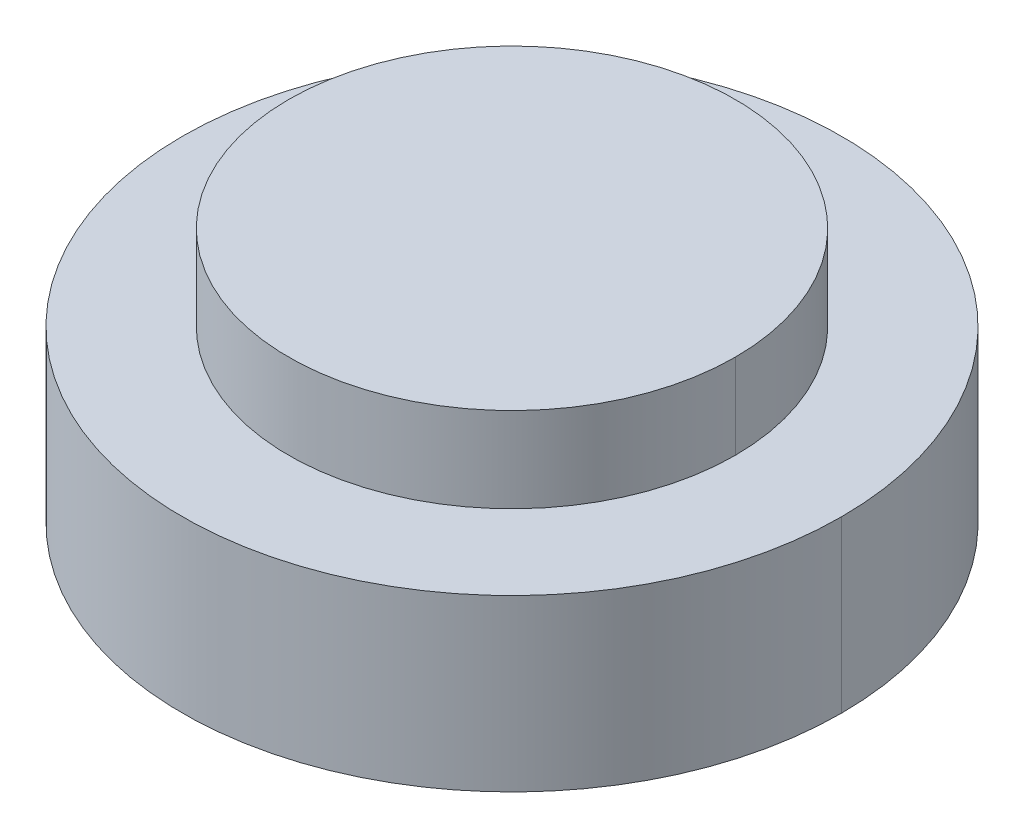
ISO-10303-21;
HEADER;
FILE_DESCRIPTION(('STEP AP214'),'2;1');
FILE_NAME('part.step','',(''),(''),'','','');
FILE_SCHEMA(('AUTOMOTIVE_DESIGN { 1 0 10303 214 1 1 1 1 }'));
ENDSEC;
DATA;
#1=APPLICATION_CONTEXT('core data for automotive mechanical design processes');
#2=APPLICATION_PROTOCOL_DEFINITION('international standard','automotive_design',2000,#1);
#3=PRODUCT_CONTEXT('',#1,'mechanical');
#4=PRODUCT('Part','Part','',(#3));
#5=PRODUCT_RELATED_PRODUCT_CATEGORY('part','',(#4));
#6=PRODUCT_DEFINITION_FORMATION('','',#4);
#7=PRODUCT_DEFINITION_CONTEXT('part definition',#1,'design');
#8=PRODUCT_DEFINITION('design','',#6,#7);
#9=PRODUCT_DEFINITION_SHAPE('','',#8);
#10=(LENGTH_UNIT() NAMED_UNIT(*) SI_UNIT(.MILLI.,.METRE.));
#11=(NAMED_UNIT(*) PLANE_ANGLE_UNIT() SI_UNIT($,.RADIAN.));
#12=(NAMED_UNIT(*) SI_UNIT($,.STERADIAN.) SOLID_ANGLE_UNIT());
#13=UNCERTAINTY_MEASURE_WITH_UNIT(LENGTH_MEASURE(1.E-05),#10,'distance_accuracy_value','');
#14=(GEOMETRIC_REPRESENTATION_CONTEXT(3) GLOBAL_UNCERTAINTY_ASSIGNED_CONTEXT((#13)) GLOBAL_UNIT_ASSIGNED_CONTEXT((#10,
#11,#12)) REPRESENTATION_CONTEXT('',''));
#15=CARTESIAN_POINT('',(0.,0.,0.));
#16=DIRECTION('',(0.,0.,1.));
#17=DIRECTION('',(1.,0.,0.));
#18=AXIS2_PLACEMENT_3D('',#15,#16,#17);
#19=CARTESIAN_POINT('',(0.,150.,0.));
#20=DIRECTION('',(0.,1.,0.));
#21=DIRECTION('',(1.,0.,0.));
#22=AXIS2_PLACEMENT_3D('',#19,#20,#21);
#23=PLANE('',#22);
#24=CARTESIAN_POINT('',(0.,150.,0.));
#25=DIRECTION('',(0.,-1.,0.));
#26=DIRECTION('',(1.,0.,0.));
#27=AXIS2_PLACEMENT_3D('',#24,#25,#26);
#28=CIRCLE('',#27,7.75);
#29=CARTESIAN_POINT('',(-7.75,150.,0.));
#30=VERTEX_POINT('',#29);
#31=CARTESIAN_POINT('',(7.75,150.,0.));
#32=VERTEX_POINT('',#31);
#33=EDGE_CURVE('E106',#30,#32,#28,.T.);
#34=ORIENTED_EDGE('',*,*,#33,.F.);
#35=CARTESIAN_POINT('',(0.,150.,0.));
#36=DIRECTION('',(0.,-1.,0.));
#37=DIRECTION('',(1.,0.,0.));
#38=AXIS2_PLACEMENT_3D('',#35,#36,#37);
#39=CIRCLE('',#38,7.75);
#40=EDGE_CURVE('E136',#32,#30,#39,.T.);
#41=ORIENTED_EDGE('',*,*,#40,.F.);
#42=EDGE_LOOP('',(#34,#41));
#43=FACE_BOUND('',#42,.T.);
#44=CARTESIAN_POINT('',(0.,150.,0.));
#45=DIRECTION('',(0.,1.,0.));
#46=DIRECTION('',(1.,0.,0.));
#47=AXIS2_PLACEMENT_3D('',#44,#45,#46);
#48=CIRCLE('',#47,77.5);
#49=CARTESIAN_POINT('',(-77.5,150.,0.));
#50=VERTEX_POINT('',#49);
#51=CARTESIAN_POINT('',(77.5,150.,0.));
#52=VERTEX_POINT('',#51);
#53=EDGE_CURVE('E10',#50,#52,#48,.T.);
#54=ORIENTED_EDGE('',*,*,#53,.F.);
#55=CARTESIAN_POINT('',(0.,150.,0.));
#56=DIRECTION('',(0.,1.,0.));
#57=DIRECTION('',(1.,0.,0.));
#58=AXIS2_PLACEMENT_3D('',#55,#56,#57);
#59=CIRCLE('',#58,77.5);
#60=EDGE_CURVE('E113',#52,#50,#59,.T.);
#61=ORIENTED_EDGE('',*,*,#60,.F.);
#62=EDGE_LOOP('',(#54,#61));
#63=FACE_BOUND('',#62,.T.);
#64=ADVANCED_FACE('F16',(#43,#63),#23,.F.);
#65=CARTESIAN_POINT('',(0.,170.,0.));
#66=DIRECTION('',(0.,1.,0.));
#67=DIRECTION('',(-1.,0.,0.));
#68=AXIS2_PLACEMENT_3D('',#65,#66,#67);
#69=CYLINDRICAL_SURFACE('',#68,77.5);
#70=DIRECTION('',(0.,1.,0.));
#71=VECTOR('',#70,1.);
#72=CARTESIAN_POINT('',(-77.5,170.,0.));
#73=LINE('',#72,#71);
#74=CARTESIAN_POINT('',(-77.5,190.,0.));
#75=VERTEX_POINT('',#74);
#76=EDGE_CURVE('E26',#50,#75,#73,.T.);
#77=ORIENTED_EDGE('',*,*,#76,.F.);
#78=ORIENTED_EDGE('',*,*,#53,.T.);
#79=DIRECTION('',(0.,1.,0.));
#80=VECTOR('',#79,1.);
#81=CARTESIAN_POINT('',(77.5,170.,0.));
#82=LINE('',#81,#80);
#83=CARTESIAN_POINT('',(77.5,190.,0.));
#84=VERTEX_POINT('',#83);
#85=EDGE_CURVE('E122',#52,#84,#82,.T.);
#86=ORIENTED_EDGE('',*,*,#85,.T.);
#87=CARTESIAN_POINT('',(0.,190.,0.));
#88=DIRECTION('',(0.,1.,0.));
#89=DIRECTION('',(1.,0.,0.));
#90=AXIS2_PLACEMENT_3D('',#87,#88,#89);
#91=CIRCLE('',#90,77.5);
#92=EDGE_CURVE('E117',#75,#84,#91,.T.);
#93=ORIENTED_EDGE('',*,*,#92,.F.);
#94=EDGE_LOOP('',(#77,#78,#86,#93));
#95=FACE_BOUND('',#94,.T.);
#96=ADVANCED_FACE('F152',(#95),#69,.T.);
#97=CARTESIAN_POINT('',(0.,170.,0.));
#98=DIRECTION('',(0.,1.,0.));
#99=DIRECTION('',(-1.,0.,0.));
#100=AXIS2_PLACEMENT_3D('',#97,#98,#99);
#101=CYLINDRICAL_SURFACE('',#100,77.5);
#102=ORIENTED_EDGE('',*,*,#85,.F.);
#103=ORIENTED_EDGE('',*,*,#60,.T.);
#104=ORIENTED_EDGE('',*,*,#76,.T.);
#105=CARTESIAN_POINT('',(0.,190.,0.));
#106=DIRECTION('',(0.,1.,0.));
#107=DIRECTION('',(1.,0.,0.));
#108=AXIS2_PLACEMENT_3D('',#105,#106,#107);
#109=CIRCLE('',#108,77.5);
#110=EDGE_CURVE('E121',#84,#75,#109,.T.);
#111=ORIENTED_EDGE('',*,*,#110,.F.);
#112=EDGE_LOOP('',(#102,#103,#104,#111));
#113=FACE_BOUND('',#112,.T.);
#114=ADVANCED_FACE('F153',(#113),#101,.T.);
#115=CARTESIAN_POINT('',(0.,190.,0.));
#116=DIRECTION('',(0.,1.,0.));
#117=DIRECTION('',(1.,0.,0.));
#118=AXIS2_PLACEMENT_3D('',#115,#116,#117);
#119=PLANE('',#118);
#120=CARTESIAN_POINT('',(0.,190.,0.));
#121=DIRECTION('',(0.,1.,0.));
#122=DIRECTION('',(1.,0.,0.));
#123=AXIS2_PLACEMENT_3D('',#120,#121,#122);
#124=CIRCLE('',#123,52.5);
#125=CARTESIAN_POINT('',(52.5,190.,0.));
#126=VERTEX_POINT('',#125);
#127=CARTESIAN_POINT('',(-52.5,190.,0.));
#128=VERTEX_POINT('',#127);
#129=EDGE_CURVE('E114',#126,#128,#124,.T.);
#130=ORIENTED_EDGE('',*,*,#129,.F.);
#131=CARTESIAN_POINT('',(0.,190.,0.));
#132=DIRECTION('',(0.,1.,0.));
#133=DIRECTION('',(1.,0.,0.));
#134=AXIS2_PLACEMENT_3D('',#131,#132,#133);
#135=CIRCLE('',#134,52.5);
#136=EDGE_CURVE('E87',#128,#126,#135,.T.);
#137=ORIENTED_EDGE('',*,*,#136,.F.);
#138=EDGE_LOOP('',(#130,#137));
#139=FACE_BOUND('',#138,.T.);
#140=ORIENTED_EDGE('',*,*,#92,.T.);
#141=ORIENTED_EDGE('',*,*,#110,.T.);
#142=EDGE_LOOP('',(#140,#141));
#143=FACE_BOUND('',#142,.T.);
#144=ADVANCED_FACE('F148',(#139,#143),#119,.T.);
#145=CARTESIAN_POINT('',(0.,180.,0.));
#146=DIRECTION('',(0.,1.,0.));
#147=DIRECTION('',(-1.,0.,0.));
#148=AXIS2_PLACEMENT_3D('',#145,#146,#147);
#149=CYLINDRICAL_SURFACE('',#148,52.5);
#150=DIRECTION('',(0.,1.,0.));
#151=VECTOR('',#150,1.);
#152=CARTESIAN_POINT('',(-52.5,180.,0.));
#153=LINE('',#152,#151);
#154=CARTESIAN_POINT('',(-52.5,210.,0.));
#155=VERTEX_POINT('',#154);
#156=EDGE_CURVE('E90',#128,#155,#153,.T.);
#157=ORIENTED_EDGE('',*,*,#156,.T.);
#158=CARTESIAN_POINT('',(0.,210.,0.));
#159=DIRECTION('',(0.,1.,0.));
#160=DIRECTION('',(1.,0.,0.));
#161=AXIS2_PLACEMENT_3D('',#158,#159,#160);
#162=CIRCLE('',#161,52.5);
#163=CARTESIAN_POINT('',(52.5,210.,0.));
#164=VERTEX_POINT('',#163);
#165=EDGE_CURVE('E91',#164,#155,#162,.T.);
#166=ORIENTED_EDGE('',*,*,#165,.F.);
#167=DIRECTION('',(0.,1.,0.));
#168=VECTOR('',#167,1.);
#169=CARTESIAN_POINT('',(52.5,180.,0.));
#170=LINE('',#169,#168);
#171=EDGE_CURVE('E80',#126,#164,#170,.T.);
#172=ORIENTED_EDGE('',*,*,#171,.F.);
#173=ORIENTED_EDGE('',*,*,#129,.T.);
#174=EDGE_LOOP('',(#157,#166,#172,#173));
#175=FACE_BOUND('',#174,.T.);
#176=ADVANCED_FACE('F94',(#175),#149,.T.);
#177=CARTESIAN_POINT('',(0.,180.,0.));
#178=DIRECTION('',(0.,1.,0.));
#179=DIRECTION('',(-1.,0.,0.));
#180=AXIS2_PLACEMENT_3D('',#177,#178,#179);
#181=CYLINDRICAL_SURFACE('',#180,52.5);
#182=ORIENTED_EDGE('',*,*,#171,.T.);
#183=CARTESIAN_POINT('',(0.,210.,0.));
#184=DIRECTION('',(0.,1.,0.));
#185=DIRECTION('',(1.,0.,0.));
#186=AXIS2_PLACEMENT_3D('',#183,#184,#185);
#187=CIRCLE('',#186,52.5);
#188=EDGE_CURVE('E85',#155,#164,#187,.T.);
#189=ORIENTED_EDGE('',*,*,#188,.F.);
#190=ORIENTED_EDGE('',*,*,#156,.F.);
#191=ORIENTED_EDGE('',*,*,#136,.T.);
#192=EDGE_LOOP('',(#182,#189,#190,#191));
#193=FACE_BOUND('',#192,.T.);
#194=ADVANCED_FACE('F82',(#193),#181,.T.);
#195=CARTESIAN_POINT('',(0.,210.,0.));
#196=DIRECTION('',(0.,1.,0.));
#197=DIRECTION('',(1.,0.,0.));
#198=AXIS2_PLACEMENT_3D('',#195,#196,#197);
#199=PLANE('',#198);
#200=ORIENTED_EDGE('',*,*,#188,.T.);
#201=ORIENTED_EDGE('',*,*,#165,.T.);
#202=EDGE_LOOP('',(#200,#201));
#203=FACE_BOUND('',#202,.T.);
#204=ADVANCED_FACE('F98',(#203),#199,.T.);
#205=CARTESIAN_POINT('',(0.,102.5,0.));
#206=DIRECTION('',(0.,-1.,0.));
#207=DIRECTION('',(0.,0.,-1.));
#208=AXIS2_PLACEMENT_3D('',#205,#206,#207);
#209=PLANE('',#208);
#210=CARTESIAN_POINT('',(0.,102.5,0.));
#211=DIRECTION('',(0.,-1.,0.));
#212=DIRECTION('',(1.,0.,0.));
#213=AXIS2_PLACEMENT_3D('',#210,#211,#212);
#214=CIRCLE('',#213,7.75);
#215=CARTESIAN_POINT('',(7.75,102.5,0.));
#216=VERTEX_POINT('',#215);
#217=CARTESIAN_POINT('',(-7.75,102.5,0.));
#218=VERTEX_POINT('',#217);
#219=EDGE_CURVE('E130',#216,#218,#214,.T.);
#220=ORIENTED_EDGE('',*,*,#219,.T.);
#221=CARTESIAN_POINT('',(0.,102.5,0.));
#222=DIRECTION('',(0.,-1.,0.));
#223=DIRECTION('',(1.,0.,0.));
#224=AXIS2_PLACEMENT_3D('',#221,#222,#223);
#225=CIRCLE('',#224,7.75);
#226=EDGE_CURVE('E100',#218,#216,#225,.T.);
#227=ORIENTED_EDGE('',*,*,#226,.T.);
#228=EDGE_LOOP('',(#220,#227));
#229=FACE_BOUND('',#228,.T.);
#230=ADVANCED_FACE('F177',(#229),#209,.T.);
#231=CARTESIAN_POINT('',(0.,126.25,0.));
#232=DIRECTION('',(0.,-1.,0.));
#233=DIRECTION('',(1.,0.,0.));
#234=AXIS2_PLACEMENT_3D('',#231,#232,#233);
#235=CYLINDRICAL_SURFACE('',#234,7.75);
#236=DIRECTION('',(0.,-1.,0.));
#237=VECTOR('',#236,1.);
#238=CARTESIAN_POINT('',(-7.75,126.25,0.));
#239=LINE('',#238,#237);
#240=EDGE_CURVE('E19',#30,#218,#239,.T.);
#241=ORIENTED_EDGE('',*,*,#240,.F.);
#242=ORIENTED_EDGE('',*,*,#33,.T.);
#243=DIRECTION('',(0.,-1.,0.));
#244=VECTOR('',#243,1.);
#245=CARTESIAN_POINT('',(7.75,126.25,0.));
#246=LINE('',#245,#244);
#247=EDGE_CURVE('E110',#32,#216,#246,.T.);
#248=ORIENTED_EDGE('',*,*,#247,.T.);
#249=ORIENTED_EDGE('',*,*,#226,.F.);
#250=EDGE_LOOP('',(#241,#242,#248,#249));
#251=FACE_BOUND('',#250,.T.);
#252=ADVANCED_FACE('F167',(#251),#235,.T.);
#253=CARTESIAN_POINT('',(0.,126.25,0.));
#254=DIRECTION('',(0.,-1.,0.));
#255=DIRECTION('',(1.,0.,0.));
#256=AXIS2_PLACEMENT_3D('',#253,#254,#255);
#257=CYLINDRICAL_SURFACE('',#256,7.75);
#258=ORIENTED_EDGE('',*,*,#247,.F.);
#259=ORIENTED_EDGE('',*,*,#40,.T.);
#260=ORIENTED_EDGE('',*,*,#240,.T.);
#261=ORIENTED_EDGE('',*,*,#219,.F.);
#262=EDGE_LOOP('',(#258,#259,#260,#261));
#263=FACE_BOUND('',#262,.T.);
#264=ADVANCED_FACE('F171',(#263),#257,.T.);
#265=CLOSED_SHELL('',(#64,#96,#114,#144,#176,#194,#204,#230,#252,#264));
#266=MANIFOLD_SOLID_BREP('B1',#265);
#267=ADVANCED_BREP_SHAPE_REPRESENTATION('',(#18,#266),#14);
#268=SHAPE_DEFINITION_REPRESENTATION(#9,#267);
ENDSEC;
END-ISO-10303-21;
